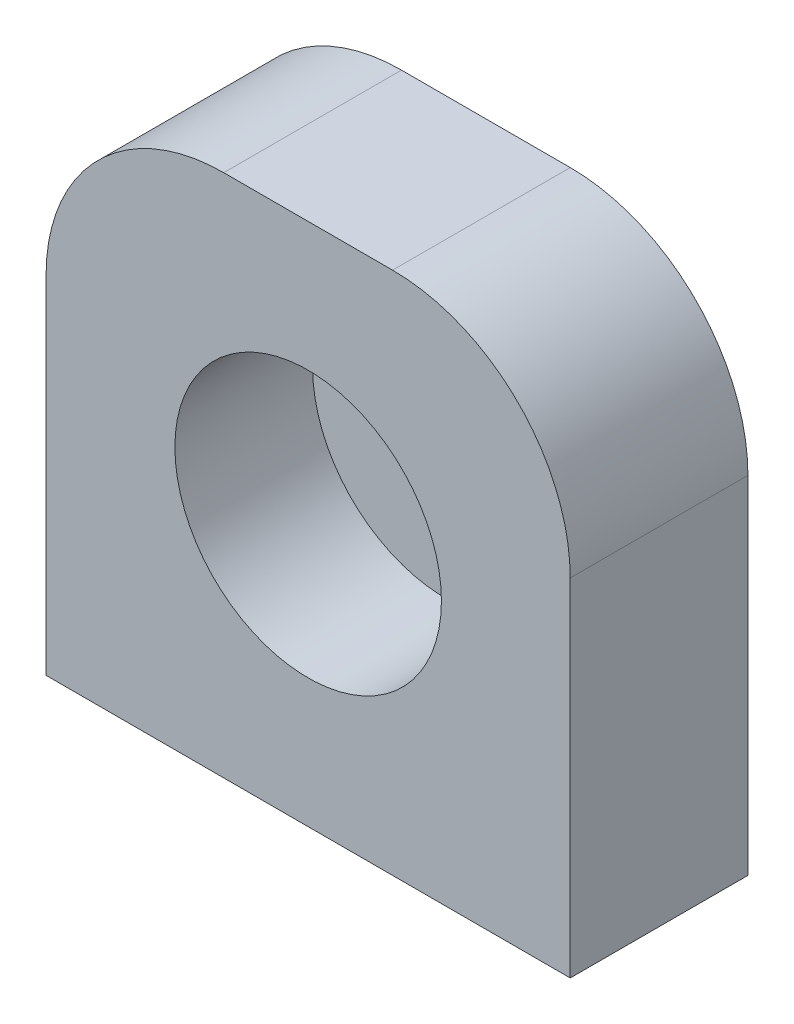
ISO-10303-21;
HEADER;
FILE_DESCRIPTION(('STEP AP214'),'2;1');
FILE_NAME('part.step','',(''),(''),'','','');
FILE_SCHEMA(('AUTOMOTIVE_DESIGN { 1 0 10303 214 1 1 1 1 }'));
ENDSEC;
DATA;
#1=APPLICATION_CONTEXT('core data for automotive mechanical design processes');
#2=APPLICATION_PROTOCOL_DEFINITION('international standard','automotive_design',2000,#1);
#3=PRODUCT_CONTEXT('',#1,'mechanical');
#4=PRODUCT('Part','Part','',(#3));
#5=PRODUCT_RELATED_PRODUCT_CATEGORY('part','',(#4));
#6=PRODUCT_DEFINITION_FORMATION('','',#4);
#7=PRODUCT_DEFINITION_CONTEXT('part definition',#1,'design');
#8=PRODUCT_DEFINITION('design','',#6,#7);
#9=PRODUCT_DEFINITION_SHAPE('','',#8);
#10=(LENGTH_UNIT() NAMED_UNIT(*) SI_UNIT(.MILLI.,.METRE.));
#11=(NAMED_UNIT(*) PLANE_ANGLE_UNIT() SI_UNIT($,.RADIAN.));
#12=(NAMED_UNIT(*) SI_UNIT($,.STERADIAN.) SOLID_ANGLE_UNIT());
#13=UNCERTAINTY_MEASURE_WITH_UNIT(LENGTH_MEASURE(1.E-05),#10,'distance_accuracy_value','');
#14=(GEOMETRIC_REPRESENTATION_CONTEXT(3) GLOBAL_UNCERTAINTY_ASSIGNED_CONTEXT((#13)) GLOBAL_UNIT_ASSIGNED_CONTEXT((#10,
#11,#12)) REPRESENTATION_CONTEXT('',''));
#15=CARTESIAN_POINT('',(0.,0.,0.));
#16=DIRECTION('',(0.,0.,1.));
#17=DIRECTION('',(1.,0.,0.));
#18=AXIS2_PLACEMENT_3D('',#15,#16,#17);
#19=CARTESIAN_POINT('',(0.,0.,4.));
#20=DIRECTION('',(1.,0.,0.));
#21=DIRECTION('',(0.,0.,-1.));
#22=AXIS2_PLACEMENT_3D('',#19,#20,#21);
#23=PLANE('',#22);
#24=DIRECTION('',(0.,-1.,0.));
#25=VECTOR('',#24,1.);
#26=CARTESIAN_POINT('',(0.,0.,4.));
#27=LINE('',#26,#25);
#28=CARTESIAN_POINT('',(0.,7.8,4.));
#29=VERTEX_POINT('',#28);
#30=CARTESIAN_POINT('',(0.,0.,4.));
#31=VERTEX_POINT('',#30);
#32=EDGE_CURVE('E103',#29,#31,#27,.T.);
#33=ORIENTED_EDGE('',*,*,#32,.F.);
#34=DIRECTION('',(0.,0.,-1.));
#35=VECTOR('',#34,1.);
#36=CARTESIAN_POINT('',(0.,7.8,4.));
#37=LINE('',#36,#35);
#38=CARTESIAN_POINT('',(0.,7.8,0.));
#39=VERTEX_POINT('',#38);
#40=EDGE_CURVE('E11',#29,#39,#37,.T.);
#41=ORIENTED_EDGE('',*,*,#40,.T.);
#42=DIRECTION('',(0.,-1.,0.));
#43=VECTOR('',#42,1.);
#44=CARTESIAN_POINT('',(0.,0.,0.));
#45=LINE('',#44,#43);
#46=CARTESIAN_POINT('',(0.,0.,0.));
#47=VERTEX_POINT('',#46);
#48=EDGE_CURVE('E124',#39,#47,#45,.T.);
#49=ORIENTED_EDGE('',*,*,#48,.T.);
#50=DIRECTION('',(0.,0.,-1.));
#51=VECTOR('',#50,1.);
#52=CARTESIAN_POINT('',(0.,0.,4.));
#53=LINE('',#52,#51);
#54=EDGE_CURVE('E117',#31,#47,#53,.T.);
#55=ORIENTED_EDGE('',*,*,#54,.F.);
#56=EDGE_LOOP('',(#33,#41,#49,#55));
#57=FACE_BOUND('',#56,.T.);
#58=ADVANCED_FACE('F41',(#57),#23,.F.);
#59=CARTESIAN_POINT('',(0.,0.,4.));
#60=DIRECTION('',(0.,1.,0.));
#61=DIRECTION('',(0.,0.,1.));
#62=AXIS2_PLACEMENT_3D('',#59,#60,#61);
#63=PLANE('',#62);
#64=DIRECTION('',(1.,0.,0.));
#65=VECTOR('',#64,1.);
#66=CARTESIAN_POINT('',(0.,0.,0.));
#67=LINE('',#66,#65);
#68=CARTESIAN_POINT('',(11.8,0.,0.));
#69=VERTEX_POINT('',#68);
#70=EDGE_CURVE('E166',#47,#69,#67,.T.);
#71=ORIENTED_EDGE('',*,*,#70,.T.);
#72=DIRECTION('',(0.,0.,-1.));
#73=VECTOR('',#72,1.);
#74=CARTESIAN_POINT('',(11.8,0.,4.));
#75=LINE('',#74,#73);
#76=CARTESIAN_POINT('',(11.8,0.,4.));
#77=VERTEX_POINT('',#76);
#78=EDGE_CURVE('E119',#77,#69,#75,.T.);
#79=ORIENTED_EDGE('',*,*,#78,.F.);
#80=DIRECTION('',(1.,0.,0.));
#81=VECTOR('',#80,1.);
#82=CARTESIAN_POINT('',(0.,0.,4.));
#83=LINE('',#82,#81);
#84=EDGE_CURVE('E106',#31,#77,#83,.T.);
#85=ORIENTED_EDGE('',*,*,#84,.F.);
#86=ORIENTED_EDGE('',*,*,#54,.T.);
#87=EDGE_LOOP('',(#71,#79,#85,#86));
#88=FACE_BOUND('',#87,.T.);
#89=ADVANCED_FACE('F116',(#88),#63,.F.);
#90=CARTESIAN_POINT('',(11.8,0.,4.));
#91=DIRECTION('',(-1.,0.,0.));
#92=DIRECTION('',(0.,0.,1.));
#93=AXIS2_PLACEMENT_3D('',#90,#91,#92);
#94=PLANE('',#93);
#95=DIRECTION('',(0.,1.,0.));
#96=VECTOR('',#95,1.);
#97=CARTESIAN_POINT('',(11.8,0.,0.));
#98=LINE('',#97,#96);
#99=CARTESIAN_POINT('',(11.8,7.8,0.));
#100=VERTEX_POINT('',#99);
#101=EDGE_CURVE('E164',#69,#100,#98,.T.);
#102=ORIENTED_EDGE('',*,*,#101,.T.);
#103=DIRECTION('',(0.,0.,-1.));
#104=VECTOR('',#103,1.);
#105=CARTESIAN_POINT('',(11.8,7.8,4.));
#106=LINE('',#105,#104);
#107=CARTESIAN_POINT('',(11.8,7.8,4.));
#108=VERTEX_POINT('',#107);
#109=EDGE_CURVE('E69',#100,#108,#106,.F.);
#110=ORIENTED_EDGE('',*,*,#109,.T.);
#111=DIRECTION('',(0.,1.,0.));
#112=VECTOR('',#111,1.);
#113=CARTESIAN_POINT('',(11.8,0.,4.));
#114=LINE('',#113,#112);
#115=EDGE_CURVE('E121',#77,#108,#114,.T.);
#116=ORIENTED_EDGE('',*,*,#115,.F.);
#117=ORIENTED_EDGE('',*,*,#78,.T.);
#118=EDGE_LOOP('',(#102,#110,#116,#117));
#119=FACE_BOUND('',#118,.T.);
#120=ADVANCED_FACE('F165',(#119),#94,.F.);
#121=CARTESIAN_POINT('',(0.,11.8,4.));
#122=DIRECTION('',(0.,-1.,0.));
#123=DIRECTION('',(0.,0.,-1.));
#124=AXIS2_PLACEMENT_3D('',#121,#122,#123);
#125=PLANE('',#124);
#126=DIRECTION('',(-1.,0.,0.));
#127=VECTOR('',#126,1.);
#128=CARTESIAN_POINT('',(0.,11.8,4.));
#129=LINE('',#128,#127);
#130=CARTESIAN_POINT('',(7.8,11.8,4.));
#131=VERTEX_POINT('',#130);
#132=CARTESIAN_POINT('',(4.,11.8,4.));
#133=VERTEX_POINT('',#132);
#134=EDGE_CURVE('E133',#131,#133,#129,.T.);
#135=ORIENTED_EDGE('',*,*,#134,.F.);
#136=DIRECTION('',(0.,0.,-1.));
#137=VECTOR('',#136,1.);
#138=CARTESIAN_POINT('',(7.8,11.8,4.));
#139=LINE('',#138,#137);
#140=CARTESIAN_POINT('',(7.8,11.8,0.));
#141=VERTEX_POINT('',#140);
#142=EDGE_CURVE('E130',#131,#141,#139,.T.);
#143=ORIENTED_EDGE('',*,*,#142,.T.);
#144=DIRECTION('',(-1.,0.,0.));
#145=VECTOR('',#144,1.);
#146=CARTESIAN_POINT('',(0.,11.8,0.));
#147=LINE('',#146,#145);
#148=CARTESIAN_POINT('',(4.,11.8,0.));
#149=VERTEX_POINT('',#148);
#150=EDGE_CURVE('E112',#141,#149,#147,.T.);
#151=ORIENTED_EDGE('',*,*,#150,.T.);
#152=DIRECTION('',(0.,0.,-1.));
#153=VECTOR('',#152,1.);
#154=CARTESIAN_POINT('',(4.,11.8,4.));
#155=LINE('',#154,#153);
#156=EDGE_CURVE('E127',#149,#133,#155,.F.);
#157=ORIENTED_EDGE('',*,*,#156,.T.);
#158=EDGE_LOOP('',(#135,#143,#151,#157));
#159=FACE_BOUND('',#158,.T.);
#160=ADVANCED_FACE('F155',(#159),#125,.F.);
#161=CARTESIAN_POINT('',(0.,0.,4.));
#162=DIRECTION('',(0.,0.,-1.));
#163=DIRECTION('',(-1.,0.,0.));
#164=AXIS2_PLACEMENT_3D('',#161,#162,#163);
#165=PLANE('',#164);
#166=CARTESIAN_POINT('',(5.9,5.9,4.));
#167=DIRECTION('',(0.,0.,1.));
#168=DIRECTION('',(1.,0.,0.));
#169=AXIS2_PLACEMENT_3D('',#166,#167,#168);
#170=CIRCLE('',#169,3.);
#171=CARTESIAN_POINT('',(8.9,5.9,4.));
#172=VERTEX_POINT('',#171);
#173=EDGE_CURVE('E176',#172,#172,#170,.T.);
#174=ORIENTED_EDGE('',*,*,#173,.F.);
#175=EDGE_LOOP('',(#174));
#176=FACE_BOUND('',#175,.T.);
#177=ORIENTED_EDGE('',*,*,#115,.T.);
#178=CARTESIAN_POINT('',(7.8,7.8,4.));
#179=DIRECTION('',(0.,0.,-1.));
#180=DIRECTION('',(-1.,0.,0.));
#181=AXIS2_PLACEMENT_3D('',#178,#179,#180);
#182=CIRCLE('',#181,4.);
#183=EDGE_CURVE('E50',#108,#131,#182,.F.);
#184=ORIENTED_EDGE('',*,*,#183,.T.);
#185=ORIENTED_EDGE('',*,*,#134,.T.);
#186=CARTESIAN_POINT('',(4.,7.8,4.));
#187=DIRECTION('',(0.,0.,-1.));
#188=DIRECTION('',(-1.,0.,0.));
#189=AXIS2_PLACEMENT_3D('',#186,#187,#188);
#190=CIRCLE('',#189,4.);
#191=EDGE_CURVE('E60',#133,#29,#190,.F.);
#192=ORIENTED_EDGE('',*,*,#191,.T.);
#193=ORIENTED_EDGE('',*,*,#32,.T.);
#194=ORIENTED_EDGE('',*,*,#84,.T.);
#195=EDGE_LOOP('',(#177,#184,#185,#192,#193,#194));
#196=FACE_BOUND('',#195,.T.);
#197=ADVANCED_FACE('F105',(#176,#196),#165,.F.);
#198=CARTESIAN_POINT('',(0.,0.,0.));
#199=DIRECTION('',(0.,0.,-1.));
#200=DIRECTION('',(-1.,0.,0.));
#201=AXIS2_PLACEMENT_3D('',#198,#199,#200);
#202=PLANE('',#201);
#203=ORIENTED_EDGE('',*,*,#150,.F.);
#204=CARTESIAN_POINT('',(7.8,7.8,0.));
#205=DIRECTION('',(0.,0.,-1.));
#206=DIRECTION('',(-1.,0.,0.));
#207=AXIS2_PLACEMENT_3D('',#204,#205,#206);
#208=CIRCLE('',#207,4.);
#209=EDGE_CURVE('E142',#141,#100,#208,.T.);
#210=ORIENTED_EDGE('',*,*,#209,.T.);
#211=ORIENTED_EDGE('',*,*,#101,.F.);
#212=ORIENTED_EDGE('',*,*,#70,.F.);
#213=ORIENTED_EDGE('',*,*,#48,.F.);
#214=CARTESIAN_POINT('',(4.,7.8,0.));
#215=DIRECTION('',(0.,0.,-1.));
#216=DIRECTION('',(-1.,0.,0.));
#217=AXIS2_PLACEMENT_3D('',#214,#215,#216);
#218=CIRCLE('',#217,4.);
#219=EDGE_CURVE('E139',#39,#149,#218,.T.);
#220=ORIENTED_EDGE('',*,*,#219,.T.);
#221=EDGE_LOOP('',(#203,#210,#211,#212,#213,#220));
#222=FACE_BOUND('',#221,.T.);
#223=ADVANCED_FACE('F163',(#222),#202,.T.);
#224=CARTESIAN_POINT('',(5.9,5.9,0.9));
#225=DIRECTION('',(0.,0.,1.));
#226=DIRECTION('',(1.,0.,0.));
#227=AXIS2_PLACEMENT_3D('',#224,#225,#226);
#228=CYLINDRICAL_SURFACE('',#227,3.);
#229=CARTESIAN_POINT('',(5.9,5.9,0.9));
#230=DIRECTION('',(0.,0.,1.));
#231=DIRECTION('',(1.,0.,0.));
#232=AXIS2_PLACEMENT_3D('',#229,#230,#231);
#233=CIRCLE('',#232,3.);
#234=CARTESIAN_POINT('',(8.9,5.9,0.9));
#235=VERTEX_POINT('',#234);
#236=EDGE_CURVE('E173',#235,#235,#233,.T.);
#237=CARTESIAN_POINT('',(8.9,5.9,0.9));
#238=CARTESIAN_POINT('',(8.9,5.9,0.932291666666667));
#239=CARTESIAN_POINT('',(8.9,5.9,0.964583333333333));
#240=CARTESIAN_POINT('',(8.9,5.9,1.02916666666667));
#241=CARTESIAN_POINT('',(8.9,5.9,1.06145833333333));
#242=CARTESIAN_POINT('',(8.9,5.9,1.12604166666667));
#243=CARTESIAN_POINT('',(8.9,5.9,1.15833333333333));
#244=CARTESIAN_POINT('',(8.9,5.9,1.22291666666667));
#245=CARTESIAN_POINT('',(8.9,5.9,1.25520833333333));
#246=CARTESIAN_POINT('',(8.9,5.9,1.31979166666667));
#247=CARTESIAN_POINT('',(8.9,5.9,1.35208333333333));
#248=CARTESIAN_POINT('',(8.9,5.9,1.41666666666667));
#249=CARTESIAN_POINT('',(8.9,5.9,1.44895833333333));
#250=CARTESIAN_POINT('',(8.9,5.9,1.51354166666667));
#251=CARTESIAN_POINT('',(8.9,5.9,1.54583333333333));
#252=CARTESIAN_POINT('',(8.9,5.9,1.61041666666667));
#253=CARTESIAN_POINT('',(8.9,5.9,1.64270833333333));
#254=CARTESIAN_POINT('',(8.9,5.9,1.70729166666667));
#255=CARTESIAN_POINT('',(8.9,5.9,1.73958333333333));
#256=CARTESIAN_POINT('',(8.9,5.9,1.80416666666667));
#257=CARTESIAN_POINT('',(8.9,5.9,1.83645833333333));
#258=CARTESIAN_POINT('',(8.9,5.9,1.90104166666667));
#259=CARTESIAN_POINT('',(8.9,5.9,1.93333333333333));
#260=CARTESIAN_POINT('',(8.9,5.9,1.99791666666667));
#261=CARTESIAN_POINT('',(8.9,5.9,2.03020833333333));
#262=CARTESIAN_POINT('',(8.9,5.9,2.09479166666667));
#263=CARTESIAN_POINT('',(8.9,5.9,2.12708333333333));
#264=CARTESIAN_POINT('',(8.9,5.9,2.19166666666667));
#265=CARTESIAN_POINT('',(8.9,5.9,2.22395833333333));
#266=CARTESIAN_POINT('',(8.9,5.9,2.28854166666667));
#267=CARTESIAN_POINT('',(8.9,5.9,2.32083333333333));
#268=CARTESIAN_POINT('',(8.9,5.9,2.38541666666667));
#269=CARTESIAN_POINT('',(8.9,5.9,2.41770833333333));
#270=CARTESIAN_POINT('',(8.9,5.9,2.48229166666667));
#271=CARTESIAN_POINT('',(8.9,5.9,2.51458333333333));
#272=CARTESIAN_POINT('',(8.9,5.9,2.57916666666667));
#273=CARTESIAN_POINT('',(8.9,5.9,2.61145833333333));
#274=CARTESIAN_POINT('',(8.9,5.9,2.67604166666667));
#275=CARTESIAN_POINT('',(8.9,5.9,2.70833333333333));
#276=CARTESIAN_POINT('',(8.9,5.9,2.77291666666667));
#277=CARTESIAN_POINT('',(8.9,5.9,2.80520833333333));
#278=CARTESIAN_POINT('',(8.9,5.9,2.86979166666667));
#279=CARTESIAN_POINT('',(8.9,5.9,2.90208333333333));
#280=CARTESIAN_POINT('',(8.9,5.9,2.96666666666667));
#281=CARTESIAN_POINT('',(8.9,5.9,2.99895833333333));
#282=CARTESIAN_POINT('',(8.9,5.9,3.06354166666667));
#283=CARTESIAN_POINT('',(8.9,5.9,3.09583333333333));
#284=CARTESIAN_POINT('',(8.9,5.9,3.16041666666667));
#285=CARTESIAN_POINT('',(8.9,5.9,3.19270833333333));
#286=CARTESIAN_POINT('',(8.9,5.9,3.25729166666667));
#287=CARTESIAN_POINT('',(8.9,5.9,3.28958333333333));
#288=CARTESIAN_POINT('',(8.9,5.9,3.35416666666667));
#289=CARTESIAN_POINT('',(8.9,5.9,3.38645833333333));
#290=CARTESIAN_POINT('',(8.9,5.9,3.45104166666667));
#291=CARTESIAN_POINT('',(8.9,5.9,3.48333333333333));
#292=CARTESIAN_POINT('',(8.9,5.9,3.54791666666667));
#293=CARTESIAN_POINT('',(8.9,5.9,3.58020833333333));
#294=CARTESIAN_POINT('',(8.9,5.9,3.64479166666667));
#295=CARTESIAN_POINT('',(8.9,5.9,3.67708333333333));
#296=CARTESIAN_POINT('',(8.9,5.9,3.74166666666667));
#297=CARTESIAN_POINT('',(8.9,5.9,3.77395833333333));
#298=CARTESIAN_POINT('',(8.9,5.9,3.83854166666667));
#299=CARTESIAN_POINT('',(8.9,5.9,3.87083333333333));
#300=CARTESIAN_POINT('',(8.9,5.9,3.93541666666667));
#301=CARTESIAN_POINT('',(8.9,5.9,3.96770833333333));
#302=CARTESIAN_POINT('',(8.9,5.9,4.));
#303=B_SPLINE_CURVE_WITH_KNOTS('',3,(#237,#238,#239,#240,#241,#242,#243,#244,#245,#246,#247,
#248,#249,#250,#251,#252,#253,#254,#255,#256,#257,#258,#259,#260,#261,#262,#263,#264,#265,#266,
#267,#268,#269,#270,#271,#272,#273,#274,#275,#276,#277,#278,#279,#280,#281,#282,#283,#284,#285,
#286,#287,#288,#289,#290,#291,#292,#293,#294,#295,#296,#297,#298,#299,#300,#301,#302),
.UNSPECIFIED.,.F.,.F.,(4,2,2,2,2,2,2,2,2,2,2,2,2,2,2,2,2,2,2,2,2,2,2,2,2,2,2,2,2,2,2,2,4),(0.,
0.0968750000000001,0.19375,0.290625,0.3875,0.484375,0.58125,0.678125,0.775,0.871875,0.96875,
1.065625,1.1625,1.259375,1.35625,1.453125,1.55,1.646875,1.74375,1.840625,1.9375,2.034375,
2.13125,2.228125,2.325,2.421875,2.51875,2.615625,2.7125,2.809375,2.90625,3.003125,3.1),.UNSPECIFIED.);
#304=EDGE_CURVE('BSEAM185',#235,#172,#303,.T.);
#305=ORIENTED_EDGE('',*,*,#236,.F.);
#306=ORIENTED_EDGE('',*,*,#173,.T.);
#307=ORIENTED_EDGE('',*,*,#304,.T.);
#308=ORIENTED_EDGE('',*,*,#304,.F.);
#309=EDGE_LOOP('',(#305,#307,#306,#308));
#310=FACE_BOUND('',#309,.T.);
#311=ADVANCED_FACE('F185',(#310),#228,.F.);
#312=CARTESIAN_POINT('',(5.9,5.9,0.9));
#313=DIRECTION('',(0.,0.,1.));
#314=DIRECTION('',(1.,0.,0.));
#315=AXIS2_PLACEMENT_3D('',#312,#313,#314);
#316=PLANE('',#315);
#317=ORIENTED_EDGE('',*,*,#236,.T.);
#318=EDGE_LOOP('',(#317));
#319=FACE_BOUND('',#318,.T.);
#320=ADVANCED_FACE('F183',(#319),#316,.T.);
#321=CARTESIAN_POINT('',(7.8,7.8,4.));
#322=DIRECTION('',(0.,0.,-1.));
#323=DIRECTION('',(-1.,0.,0.));
#324=AXIS2_PLACEMENT_3D('',#321,#322,#323);
#325=CYLINDRICAL_SURFACE('',#324,4.);
#326=ORIENTED_EDGE('',*,*,#183,.F.);
#327=ORIENTED_EDGE('',*,*,#109,.F.);
#328=ORIENTED_EDGE('',*,*,#209,.F.);
#329=ORIENTED_EDGE('',*,*,#142,.F.);
#330=EDGE_LOOP('',(#326,#327,#328,#329));
#331=FACE_BOUND('',#330,.T.);
#332=ADVANCED_FACE('F160',(#331),#325,.T.);
#333=CARTESIAN_POINT('',(4.,7.8,4.));
#334=DIRECTION('',(0.,0.,-1.));
#335=DIRECTION('',(-1.,0.,0.));
#336=AXIS2_PLACEMENT_3D('',#333,#334,#335);
#337=CYLINDRICAL_SURFACE('',#336,4.);
#338=ORIENTED_EDGE('',*,*,#191,.F.);
#339=ORIENTED_EDGE('',*,*,#156,.F.);
#340=ORIENTED_EDGE('',*,*,#219,.F.);
#341=ORIENTED_EDGE('',*,*,#40,.F.);
#342=EDGE_LOOP('',(#338,#339,#340,#341));
#343=FACE_BOUND('',#342,.T.);
#344=ADVANCED_FACE('F43',(#343),#337,.T.);
#345=CLOSED_SHELL('',(#58,#89,#120,#160,#197,#223,#311,#320,#332,#344));
#346=MANIFOLD_SOLID_BREP('B2',#345);
#347=ADVANCED_BREP_SHAPE_REPRESENTATION('',(#18,#346),#14);
#348=SHAPE_DEFINITION_REPRESENTATION(#9,#347);
ENDSEC;
END-ISO-10303-21;
